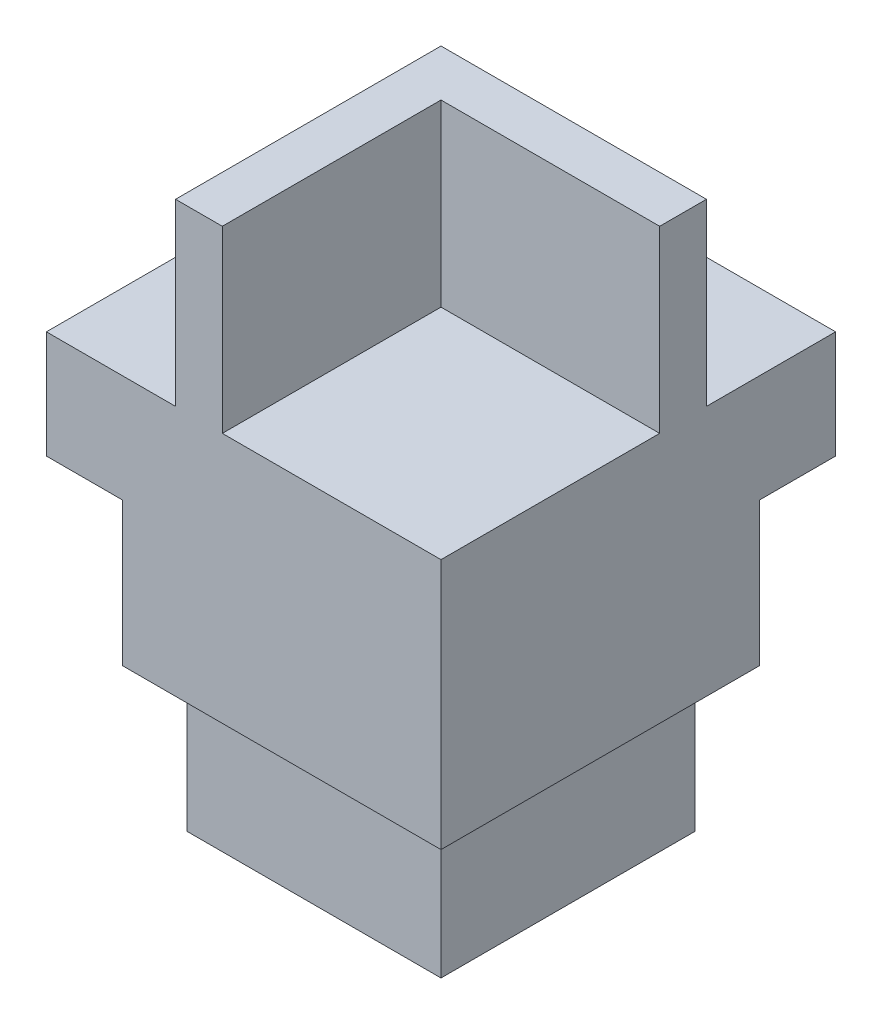
ISO-10303-21;
HEADER;
FILE_DESCRIPTION(('STEP AP214'),'2;1');
FILE_NAME('part.step','',(''),(''),'','','');
FILE_SCHEMA(('AUTOMOTIVE_DESIGN { 1 0 10303 214 1 1 1 1 }'));
ENDSEC;
DATA;
#1=APPLICATION_CONTEXT('core data for automotive mechanical design processes');
#2=APPLICATION_PROTOCOL_DEFINITION('international standard','automotive_design',2000,#1);
#3=PRODUCT_CONTEXT('',#1,'mechanical');
#4=PRODUCT('Part','Part','',(#3));
#5=PRODUCT_RELATED_PRODUCT_CATEGORY('part','',(#4));
#6=PRODUCT_DEFINITION_FORMATION('','',#4);
#7=PRODUCT_DEFINITION_CONTEXT('part definition',#1,'design');
#8=PRODUCT_DEFINITION('design','',#6,#7);
#9=PRODUCT_DEFINITION_SHAPE('','',#8);
#10=(LENGTH_UNIT() NAMED_UNIT(*) SI_UNIT(.MILLI.,.METRE.));
#11=(NAMED_UNIT(*) PLANE_ANGLE_UNIT() SI_UNIT($,.RADIAN.));
#12=(NAMED_UNIT(*) SI_UNIT($,.STERADIAN.) SOLID_ANGLE_UNIT());
#13=UNCERTAINTY_MEASURE_WITH_UNIT(LENGTH_MEASURE(1.E-05),#10,'distance_accuracy_value','');
#14=(GEOMETRIC_REPRESENTATION_CONTEXT(3) GLOBAL_UNCERTAINTY_ASSIGNED_CONTEXT((#13)) GLOBAL_UNIT_ASSIGNED_CONTEXT((#10,
#11,#12)) REPRESENTATION_CONTEXT('',''));
#15=CARTESIAN_POINT('',(0.,0.,0.));
#16=DIRECTION('',(0.,0.,1.));
#17=DIRECTION('',(1.,0.,0.));
#18=AXIS2_PLACEMENT_3D('',#15,#16,#17);
#19=CARTESIAN_POINT('',(11.9599615463912,40.,25.3407277505822));
#20=DIRECTION('',(-1.,0.,0.));
#21=DIRECTION('',(0.,0.,1.));
#22=AXIS2_PLACEMENT_3D('',#19,#20,#21);
#23=PLANE('',#22);
#24=DIRECTION('',(0.,1.,0.));
#25=VECTOR('',#24,1.);
#26=CARTESIAN_POINT('',(11.9599615463912,27.5,34.3407277505822));
#27=LINE('',#26,#25);
#28=CARTESIAN_POINT('',(11.9599615463912,27.5,34.3407277505822));
#29=VERTEX_POINT('',#28);
#30=CARTESIAN_POINT('',(11.9599615463912,40.,34.3407277505822));
#31=VERTEX_POINT('',#30);
#32=EDGE_CURVE('E186',#29,#31,#27,.T.);
#33=ORIENTED_EDGE('',*,*,#32,.T.);
#34=DIRECTION('',(0.,0.,-1.));
#35=VECTOR('',#34,1.);
#36=CARTESIAN_POINT('',(11.9599615463912,40.,25.3407277505822));
#37=LINE('',#36,#35);
#38=CARTESIAN_POINT('',(11.9599615463912,40.,37.6007277505823));
#39=VERTEX_POINT('',#38);
#40=EDGE_CURVE('E314',#39,#31,#37,.T.);
#41=ORIENTED_EDGE('',*,*,#40,.F.);
#42=DIRECTION('',(0.,1.,0.));
#43=VECTOR('',#42,1.);
#44=CARTESIAN_POINT('',(11.9599615463912,27.5,37.6007277505823));
#45=LINE('',#44,#43);
#46=CARTESIAN_POINT('',(11.9599615463912,27.5,37.6007277505823));
#47=VERTEX_POINT('',#46);
#48=EDGE_CURVE('E297',#47,#39,#45,.T.);
#49=ORIENTED_EDGE('',*,*,#48,.F.);
#50=DIRECTION('',(0.,0.,-1.));
#51=VECTOR('',#50,1.);
#52=CARTESIAN_POINT('',(11.9599615463912,27.5,52.8407277505822));
#53=LINE('',#52,#51);
#54=CARTESIAN_POINT('',(11.9599615463912,27.5,52.8407277505822));
#55=VERTEX_POINT('',#54);
#56=EDGE_CURVE('E281',#55,#47,#53,.T.);
#57=ORIENTED_EDGE('',*,*,#56,.F.);
#58=DIRECTION('',(0.,-1.,0.));
#59=VECTOR('',#58,1.);
#60=CARTESIAN_POINT('',(11.9599615463912,40.,52.8407277505822));
#61=LINE('',#60,#59);
#62=CARTESIAN_POINT('',(11.9599615463912,10.,52.8407277505822));
#63=VERTEX_POINT('',#62);
#64=EDGE_CURVE('E48',#55,#63,#61,.T.);
#65=ORIENTED_EDGE('',*,*,#64,.T.);
#66=DIRECTION('',(0.,0.,1.));
#67=VECTOR('',#66,1.);
#68=CARTESIAN_POINT('',(11.9599615463912,10.,52.8407277505822));
#69=LINE('',#68,#67);
#70=CARTESIAN_POINT('',(11.9599615463912,10.,30.6407277505822));
#71=VERTEX_POINT('',#70);
#72=EDGE_CURVE('E226',#71,#63,#69,.T.);
#73=ORIENTED_EDGE('',*,*,#72,.F.);
#74=DIRECTION('',(0.,-1.,0.));
#75=VECTOR('',#74,1.);
#76=CARTESIAN_POINT('',(11.9599615463912,20.,30.6407277505822));
#77=LINE('',#76,#75);
#78=CARTESIAN_POINT('',(11.9599615463912,20.,30.6407277505822));
#79=VERTEX_POINT('',#78);
#80=EDGE_CURVE('E274',#79,#71,#77,.T.);
#81=ORIENTED_EDGE('',*,*,#80,.F.);
#82=DIRECTION('',(0.,0.,1.));
#83=VECTOR('',#82,1.);
#84=CARTESIAN_POINT('',(11.9599615463912,20.,0.));
#85=LINE('',#84,#83);
#86=CARTESIAN_POINT('',(11.9599615463912,20.,25.3407277505822));
#87=VERTEX_POINT('',#86);
#88=EDGE_CURVE('E261',#87,#79,#85,.T.);
#89=ORIENTED_EDGE('',*,*,#88,.F.);
#90=DIRECTION('',(0.,-1.,0.));
#91=VECTOR('',#90,1.);
#92=CARTESIAN_POINT('',(11.9599615463912,40.,25.3407277505822));
#93=LINE('',#92,#91);
#94=CARTESIAN_POINT('',(11.9599615463912,27.5,25.3407277505822));
#95=VERTEX_POINT('',#94);
#96=EDGE_CURVE('E321',#95,#87,#93,.T.);
#97=ORIENTED_EDGE('',*,*,#96,.F.);
#98=DIRECTION('',(0.,0.,-1.));
#99=VECTOR('',#98,1.);
#100=CARTESIAN_POINT('',(11.9599615463912,27.5,0.));
#101=LINE('',#100,#99);
#102=EDGE_CURVE('E352',#29,#95,#101,.T.);
#103=ORIENTED_EDGE('',*,*,#102,.F.);
#104=EDGE_LOOP('',(#33,#41,#49,#57,#65,#73,#81,#89,#97,#103));
#105=FACE_BOUND('',#104,.T.);
#106=ADVANCED_FACE('F39',(#105),#23,.F.);
#107=CARTESIAN_POINT('',(-15.5400384536088,40.,25.3407277505822));
#108=DIRECTION('',(1.,0.,0.));
#109=DIRECTION('',(0.,0.,-1.));
#110=AXIS2_PLACEMENT_3D('',#107,#108,#109);
#111=PLANE('',#110);
#112=DIRECTION('',(0.,0.,1.));
#113=VECTOR('',#112,1.);
#114=CARTESIAN_POINT('',(-15.5400384536088,27.5,0.));
#115=LINE('',#114,#113);
#116=CARTESIAN_POINT('',(-15.5400384536088,27.5,25.3407277505822));
#117=VERTEX_POINT('',#116);
#118=CARTESIAN_POINT('',(-15.5400384536088,27.5,52.8407277505822));
#119=VERTEX_POINT('',#118);
#120=EDGE_CURVE('E172',#117,#119,#115,.T.);
#121=ORIENTED_EDGE('',*,*,#120,.F.);
#122=DIRECTION('',(0.,-1.,0.));
#123=VECTOR('',#122,1.);
#124=CARTESIAN_POINT('',(-15.5400384536088,40.,25.3407277505822));
#125=LINE('',#124,#123);
#126=CARTESIAN_POINT('',(-15.5400384536088,20.,25.3407277505822));
#127=VERTEX_POINT('',#126);
#128=EDGE_CURVE('E318',#117,#127,#125,.T.);
#129=ORIENTED_EDGE('',*,*,#128,.T.);
#130=DIRECTION('',(0.,0.,-1.));
#131=VECTOR('',#130,1.);
#132=CARTESIAN_POINT('',(-15.5400384536088,20.,0.));
#133=LINE('',#132,#131);
#134=CARTESIAN_POINT('',(-15.5400384536088,20.,52.8407277505822));
#135=VERTEX_POINT('',#134);
#136=EDGE_CURVE('E253',#135,#127,#133,.T.);
#137=ORIENTED_EDGE('',*,*,#136,.F.);
#138=DIRECTION('',(0.,-1.,0.));
#139=VECTOR('',#138,1.);
#140=CARTESIAN_POINT('',(-15.5400384536088,40.,52.8407277505822));
#141=LINE('',#140,#139);
#142=EDGE_CURVE('E12',#119,#135,#141,.T.);
#143=ORIENTED_EDGE('',*,*,#142,.F.);
#144=EDGE_LOOP('',(#121,#129,#137,#143));
#145=FACE_BOUND('',#144,.T.);
#146=ADVANCED_FACE('F41',(#145),#111,.F.);
#147=CARTESIAN_POINT('',(-15.5400384536088,40.,25.3407277505822));
#148=DIRECTION('',(0.,0.,1.));
#149=DIRECTION('',(1.,0.,0.));
#150=AXIS2_PLACEMENT_3D('',#147,#148,#149);
#151=PLANE('',#150);
#152=DIRECTION('',(-1.,0.,0.));
#153=VECTOR('',#152,1.);
#154=CARTESIAN_POINT('',(0.,27.5,25.3407277505822));
#155=LINE('',#154,#153);
#156=EDGE_CURVE('E188',#95,#117,#155,.T.);
#157=ORIENTED_EDGE('',*,*,#156,.F.);
#158=ORIENTED_EDGE('',*,*,#96,.T.);
#159=DIRECTION('',(1.,0.,0.));
#160=VECTOR('',#159,1.);
#161=CARTESIAN_POINT('',(0.,20.,25.3407277505822));
#162=LINE('',#161,#160);
#163=EDGE_CURVE('E257',#127,#87,#162,.T.);
#164=ORIENTED_EDGE('',*,*,#163,.F.);
#165=ORIENTED_EDGE('',*,*,#128,.F.);
#166=EDGE_LOOP('',(#157,#158,#164,#165));
#167=FACE_BOUND('',#166,.T.);
#168=ADVANCED_FACE('F355',(#167),#151,.F.);
#169=CARTESIAN_POINT('',(0.,40.,0.));
#170=DIRECTION('',(0.,1.,0.));
#171=DIRECTION('',(0.,0.,1.));
#172=AXIS2_PLACEMENT_3D('',#169,#170,#171);
#173=PLANE('',#172);
#174=ORIENTED_EDGE('',*,*,#40,.T.);
#175=DIRECTION('',(-1.,0.,0.));
#176=VECTOR('',#175,1.);
#177=CARTESIAN_POINT('',(0.,40.,34.3407277505822));
#178=LINE('',#177,#176);
#179=CARTESIAN_POINT('',(-6.5400384536088,40.,34.3407277505822));
#180=VERTEX_POINT('',#179);
#181=EDGE_CURVE('E176',#31,#180,#178,.T.);
#182=ORIENTED_EDGE('',*,*,#181,.T.);
#183=DIRECTION('',(0.,0.,-1.));
#184=VECTOR('',#183,1.);
#185=CARTESIAN_POINT('',(-6.5400384536088,40.,0.));
#186=LINE('',#185,#184);
#187=CARTESIAN_POINT('',(-6.5400384536088,40.,52.8407277505822));
#188=VERTEX_POINT('',#187);
#189=EDGE_CURVE('E363',#188,#180,#186,.T.);
#190=ORIENTED_EDGE('',*,*,#189,.F.);
#191=DIRECTION('',(1.,0.,0.));
#192=VECTOR('',#191,1.);
#193=CARTESIAN_POINT('',(-15.5400384536088,40.,52.8407277505822));
#194=LINE('',#193,#192);
#195=CARTESIAN_POINT('',(-3.28003845360881,40.,52.8407277505822));
#196=VERTEX_POINT('',#195);
#197=EDGE_CURVE('E181',#188,#196,#194,.T.);
#198=ORIENTED_EDGE('',*,*,#197,.T.);
#199=DIRECTION('',(0.,0.,1.));
#200=VECTOR('',#199,1.);
#201=CARTESIAN_POINT('',(-3.28003845360881,40.,52.8407277505822));
#202=LINE('',#201,#200);
#203=CARTESIAN_POINT('',(-3.28003845360881,40.,37.6007277505823));
#204=VERTEX_POINT('',#203);
#205=EDGE_CURVE('E286',#204,#196,#202,.T.);
#206=ORIENTED_EDGE('',*,*,#205,.F.);
#207=DIRECTION('',(-1.,0.,0.));
#208=VECTOR('',#207,1.);
#209=CARTESIAN_POINT('',(11.9599615463912,40.,37.6007277505823));
#210=LINE('',#209,#208);
#211=EDGE_CURVE('E273',#39,#204,#210,.T.);
#212=ORIENTED_EDGE('',*,*,#211,.F.);
#213=EDGE_LOOP('',(#174,#182,#190,#198,#206,#212));
#214=FACE_BOUND('',#213,.T.);
#215=ADVANCED_FACE('F373',(#214),#173,.T.);
#216=CARTESIAN_POINT('',(-15.5400384536088,40.,52.8407277505822));
#217=DIRECTION('',(0.,0.,-1.));
#218=DIRECTION('',(-1.,0.,0.));
#219=AXIS2_PLACEMENT_3D('',#216,#217,#218);
#220=PLANE('',#219);
#221=ORIENTED_EDGE('',*,*,#197,.F.);
#222=DIRECTION('',(0.,1.,0.));
#223=VECTOR('',#222,1.);
#224=CARTESIAN_POINT('',(-6.54003845360881,27.5,52.8407277505822));
#225=LINE('',#224,#223);
#226=CARTESIAN_POINT('',(-6.54003845360881,27.5,52.8407277505822));
#227=VERTEX_POINT('',#226);
#228=EDGE_CURVE('E55',#227,#188,#225,.T.);
#229=ORIENTED_EDGE('',*,*,#228,.F.);
#230=DIRECTION('',(1.,0.,0.));
#231=VECTOR('',#230,1.);
#232=CARTESIAN_POINT('',(0.,27.5,52.8407277505822));
#233=LINE('',#232,#231);
#234=EDGE_CURVE('E167',#119,#227,#233,.T.);
#235=ORIENTED_EDGE('',*,*,#234,.F.);
#236=ORIENTED_EDGE('',*,*,#142,.T.);
#237=DIRECTION('',(-1.,0.,0.));
#238=VECTOR('',#237,1.);
#239=CARTESIAN_POINT('',(0.,20.,52.8407277505822));
#240=LINE('',#239,#238);
#241=CARTESIAN_POINT('',(-10.2400384536088,20.,52.8407277505822));
#242=VERTEX_POINT('',#241);
#243=EDGE_CURVE('E249',#242,#135,#240,.T.);
#244=ORIENTED_EDGE('',*,*,#243,.F.);
#245=DIRECTION('',(0.,-1.,0.));
#246=VECTOR('',#245,1.);
#247=CARTESIAN_POINT('',(-10.2400384536088,20.,52.8407277505822));
#248=LINE('',#247,#246);
#249=CARTESIAN_POINT('',(-10.2400384536088,10.,52.8407277505822));
#250=VERTEX_POINT('',#249);
#251=EDGE_CURVE('E268',#242,#250,#248,.T.);
#252=ORIENTED_EDGE('',*,*,#251,.T.);
#253=DIRECTION('',(-1.,0.,0.));
#254=VECTOR('',#253,1.);
#255=CARTESIAN_POINT('',(-10.2400384536088,10.,52.8407277505822));
#256=LINE('',#255,#254);
#257=EDGE_CURVE('E237',#63,#250,#256,.T.);
#258=ORIENTED_EDGE('',*,*,#257,.F.);
#259=ORIENTED_EDGE('',*,*,#64,.F.);
#260=DIRECTION('',(1.,0.,0.));
#261=VECTOR('',#260,1.);
#262=CARTESIAN_POINT('',(11.9599615463912,27.5,52.8407277505822));
#263=LINE('',#262,#261);
#264=CARTESIAN_POINT('',(-3.28003845360881,27.5,52.8407277505822));
#265=VERTEX_POINT('',#264);
#266=EDGE_CURVE('E294',#265,#55,#263,.T.);
#267=ORIENTED_EDGE('',*,*,#266,.F.);
#268=DIRECTION('',(0.,1.,0.));
#269=VECTOR('',#268,1.);
#270=CARTESIAN_POINT('',(-3.28003845360881,27.5,52.8407277505822));
#271=LINE('',#270,#269);
#272=EDGE_CURVE('E304',#265,#196,#271,.T.);
#273=ORIENTED_EDGE('',*,*,#272,.T.);
#274=EDGE_LOOP('',(#221,#229,#235,#236,#244,#252,#258,#259,#267,#273));
#275=FACE_BOUND('',#274,.T.);
#276=ADVANCED_FACE('F179',(#275),#220,.F.);
#277=CARTESIAN_POINT('',(-10.2400384536088,20.,0.));
#278=DIRECTION('',(-1.,0.,0.));
#279=DIRECTION('',(0.,0.,1.));
#280=AXIS2_PLACEMENT_3D('',#277,#278,#279);
#281=PLANE('',#280);
#282=DIRECTION('',(0.,-1.,0.));
#283=VECTOR('',#282,1.);
#284=CARTESIAN_POINT('',(-10.2400384536088,20.,30.6407277505822));
#285=LINE('',#284,#283);
#286=CARTESIAN_POINT('',(-10.2400384536088,20.,30.6407277505822));
#287=VERTEX_POINT('',#286);
#288=CARTESIAN_POINT('',(-10.2400384536088,10.,30.6407277505822));
#289=VERTEX_POINT('',#288);
#290=EDGE_CURVE('E269',#287,#289,#285,.T.);
#291=ORIENTED_EDGE('',*,*,#290,.T.);
#292=DIRECTION('',(0.,0.,-1.));
#293=VECTOR('',#292,1.);
#294=CARTESIAN_POINT('',(-10.2400384536088,10.,52.8407277505822));
#295=LINE('',#294,#293);
#296=EDGE_CURVE('E240',#250,#289,#295,.T.);
#297=ORIENTED_EDGE('',*,*,#296,.F.);
#298=ORIENTED_EDGE('',*,*,#251,.F.);
#299=DIRECTION('',(0.,0.,-1.));
#300=VECTOR('',#299,1.);
#301=CARTESIAN_POINT('',(-10.2400384536088,20.,0.));
#302=LINE('',#301,#300);
#303=EDGE_CURVE('E246',#242,#287,#302,.T.);
#304=ORIENTED_EDGE('',*,*,#303,.T.);
#305=EDGE_LOOP('',(#291,#297,#298,#304));
#306=FACE_BOUND('',#305,.T.);
#307=ADVANCED_FACE('F340',(#306),#281,.T.);
#308=CARTESIAN_POINT('',(0.,20.,30.6407277505822));
#309=DIRECTION('',(0.,0.,1.));
#310=DIRECTION('',(1.,0.,0.));
#311=AXIS2_PLACEMENT_3D('',#308,#309,#310);
#312=PLANE('',#311);
#313=DIRECTION('',(1.,0.,0.));
#314=VECTOR('',#313,1.);
#315=CARTESIAN_POINT('',(-10.2400384536088,10.,30.6407277505822));
#316=LINE('',#315,#314);
#317=EDGE_CURVE('E243',#289,#71,#316,.T.);
#318=ORIENTED_EDGE('',*,*,#317,.F.);
#319=ORIENTED_EDGE('',*,*,#290,.F.);
#320=DIRECTION('',(-1.,0.,0.));
#321=VECTOR('',#320,1.);
#322=CARTESIAN_POINT('',(0.,20.,30.6407277505822));
#323=LINE('',#322,#321);
#324=EDGE_CURVE('E264',#79,#287,#323,.T.);
#325=ORIENTED_EDGE('',*,*,#324,.F.);
#326=ORIENTED_EDGE('',*,*,#80,.T.);
#327=EDGE_LOOP('',(#318,#319,#325,#326));
#328=FACE_BOUND('',#327,.T.);
#329=ADVANCED_FACE('F345',(#328),#312,.F.);
#330=CARTESIAN_POINT('',(-3.28003845360881,27.5,52.8407277505822));
#331=DIRECTION('',(-1.,0.,0.));
#332=DIRECTION('',(0.,0.,1.));
#333=AXIS2_PLACEMENT_3D('',#330,#331,#332);
#334=PLANE('',#333);
#335=ORIENTED_EDGE('',*,*,#205,.T.);
#336=ORIENTED_EDGE('',*,*,#272,.F.);
#337=DIRECTION('',(0.,0.,1.));
#338=VECTOR('',#337,1.);
#339=CARTESIAN_POINT('',(-3.28003845360881,27.5,52.8407277505822));
#340=LINE('',#339,#338);
#341=CARTESIAN_POINT('',(-3.28003845360881,27.5,37.6007277505823));
#342=VERTEX_POINT('',#341);
#343=EDGE_CURVE('E290',#342,#265,#340,.T.);
#344=ORIENTED_EDGE('',*,*,#343,.F.);
#345=DIRECTION('',(0.,1.,0.));
#346=VECTOR('',#345,1.);
#347=CARTESIAN_POINT('',(-3.28003845360881,27.5,37.6007277505823));
#348=LINE('',#347,#346);
#349=EDGE_CURVE('E307',#342,#204,#348,.T.);
#350=ORIENTED_EDGE('',*,*,#349,.T.);
#351=EDGE_LOOP('',(#335,#336,#344,#350));
#352=FACE_BOUND('',#351,.T.);
#353=ADVANCED_FACE('F381',(#352),#334,.F.);
#354=CARTESIAN_POINT('',(11.9599615463912,27.5,37.6007277505823));
#355=DIRECTION('',(0.,0.,-1.));
#356=DIRECTION('',(-1.,0.,0.));
#357=AXIS2_PLACEMENT_3D('',#354,#355,#356);
#358=PLANE('',#357);
#359=ORIENTED_EDGE('',*,*,#211,.T.);
#360=ORIENTED_EDGE('',*,*,#349,.F.);
#361=DIRECTION('',(-1.,0.,0.));
#362=VECTOR('',#361,1.);
#363=CARTESIAN_POINT('',(11.9599615463912,27.5,37.6007277505823));
#364=LINE('',#363,#362);
#365=EDGE_CURVE('E285',#47,#342,#364,.T.);
#366=ORIENTED_EDGE('',*,*,#365,.F.);
#367=ORIENTED_EDGE('',*,*,#48,.T.);
#368=EDGE_LOOP('',(#359,#360,#366,#367));
#369=FACE_BOUND('',#368,.T.);
#370=ADVANCED_FACE('F376',(#369),#358,.F.);
#371=CARTESIAN_POINT('',(0.,27.5,0.));
#372=DIRECTION('',(0.,1.,0.));
#373=DIRECTION('',(0.,0.,1.));
#374=AXIS2_PLACEMENT_3D('',#371,#372,#373);
#375=PLANE('',#374);
#376=ORIENTED_EDGE('',*,*,#56,.T.);
#377=ORIENTED_EDGE('',*,*,#365,.T.);
#378=ORIENTED_EDGE('',*,*,#343,.T.);
#379=ORIENTED_EDGE('',*,*,#266,.T.);
#380=EDGE_LOOP('',(#376,#377,#378,#379));
#381=FACE_BOUND('',#380,.T.);
#382=ADVANCED_FACE('F379',(#381),#375,.T.);
#383=CARTESIAN_POINT('',(0.,20.,0.));
#384=DIRECTION('',(0.,-1.,0.));
#385=DIRECTION('',(0.,0.,-1.));
#386=AXIS2_PLACEMENT_3D('',#383,#384,#385);
#387=PLANE('',#386);
#388=ORIENTED_EDGE('',*,*,#303,.F.);
#389=ORIENTED_EDGE('',*,*,#243,.T.);
#390=ORIENTED_EDGE('',*,*,#136,.T.);
#391=ORIENTED_EDGE('',*,*,#163,.T.);
#392=ORIENTED_EDGE('',*,*,#88,.T.);
#393=ORIENTED_EDGE('',*,*,#324,.T.);
#394=EDGE_LOOP('',(#388,#389,#390,#391,#392,#393));
#395=FACE_BOUND('',#394,.T.);
#396=ADVANCED_FACE('F347',(#395),#387,.T.);
#397=CARTESIAN_POINT('',(0.,10.,0.));
#398=DIRECTION('',(0.,-1.,0.));
#399=DIRECTION('',(0.,0.,-1.));
#400=AXIS2_PLACEMENT_3D('',#397,#398,#399);
#401=PLANE('',#400);
#402=DIRECTION('',(1.,0.,0.));
#403=VECTOR('',#402,1.);
#404=CARTESIAN_POINT('',(-7.9900384536088,10.,32.8907277505822));
#405=LINE('',#404,#403);
#406=CARTESIAN_POINT('',(-7.9900384536088,10.,32.8907277505822));
#407=VERTEX_POINT('',#406);
#408=CARTESIAN_POINT('',(9.7099615463912,10.,32.8907277505822));
#409=VERTEX_POINT('',#408);
#410=EDGE_CURVE('E205',#407,#409,#405,.T.);
#411=ORIENTED_EDGE('',*,*,#410,.F.);
#412=DIRECTION('',(0.,0.,-1.));
#413=VECTOR('',#412,1.);
#414=CARTESIAN_POINT('',(-7.9900384536088,10.,50.5907277505822));
#415=LINE('',#414,#413);
#416=CARTESIAN_POINT('',(-7.9900384536088,10.,50.5907277505822));
#417=VERTEX_POINT('',#416);
#418=EDGE_CURVE('E201',#417,#407,#415,.T.);
#419=ORIENTED_EDGE('',*,*,#418,.F.);
#420=DIRECTION('',(-1.,0.,0.));
#421=VECTOR('',#420,1.);
#422=CARTESIAN_POINT('',(-7.9900384536088,10.,50.5907277505822));
#423=LINE('',#422,#421);
#424=CARTESIAN_POINT('',(9.7099615463912,10.,50.5907277505822));
#425=VERTEX_POINT('',#424);
#426=EDGE_CURVE('E196',#425,#417,#423,.T.);
#427=ORIENTED_EDGE('',*,*,#426,.F.);
#428=DIRECTION('',(0.,0.,1.));
#429=VECTOR('',#428,1.);
#430=CARTESIAN_POINT('',(9.7099615463912,10.,50.5907277505822));
#431=LINE('',#430,#429);
#432=EDGE_CURVE('E192',#409,#425,#431,.T.);
#433=ORIENTED_EDGE('',*,*,#432,.F.);
#434=EDGE_LOOP('',(#411,#419,#427,#433));
#435=FACE_BOUND('',#434,.T.);
#436=ORIENTED_EDGE('',*,*,#72,.T.);
#437=ORIENTED_EDGE('',*,*,#257,.T.);
#438=ORIENTED_EDGE('',*,*,#296,.T.);
#439=ORIENTED_EDGE('',*,*,#317,.T.);
#440=EDGE_LOOP('',(#436,#437,#438,#439));
#441=FACE_BOUND('',#440,.T.);
#442=ADVANCED_FACE('F337',(#435,#441),#401,.T.);
#443=CARTESIAN_POINT('',(9.7099615463912,10.,50.5907277505822));
#444=DIRECTION('',(1.,0.,0.));
#445=DIRECTION('',(0.,0.,-1.));
#446=AXIS2_PLACEMENT_3D('',#443,#444,#445);
#447=PLANE('',#446);
#448=DIRECTION('',(0.,0.,1.));
#449=VECTOR('',#448,1.);
#450=CARTESIAN_POINT('',(9.7099615463912,0.,50.5907277505822));
#451=LINE('',#450,#449);
#452=CARTESIAN_POINT('',(9.7099615463912,0.,32.8907277505822));
#453=VERTEX_POINT('',#452);
#454=CARTESIAN_POINT('',(9.7099615463912,0.,50.5907277505822));
#455=VERTEX_POINT('',#454);
#456=EDGE_CURVE('E210',#453,#455,#451,.T.);
#457=ORIENTED_EDGE('',*,*,#456,.F.);
#458=DIRECTION('',(0.,-1.,0.));
#459=VECTOR('',#458,1.);
#460=CARTESIAN_POINT('',(9.7099615463912,10.,32.8907277505822));
#461=LINE('',#460,#459);
#462=EDGE_CURVE('E223',#409,#453,#461,.T.);
#463=ORIENTED_EDGE('',*,*,#462,.F.);
#464=ORIENTED_EDGE('',*,*,#432,.T.);
#465=DIRECTION('',(0.,-1.,0.));
#466=VECTOR('',#465,1.);
#467=CARTESIAN_POINT('',(9.7099615463912,10.,50.5907277505822));
#468=LINE('',#467,#466);
#469=EDGE_CURVE('E209',#425,#455,#468,.T.);
#470=ORIENTED_EDGE('',*,*,#469,.T.);
#471=EDGE_LOOP('',(#457,#463,#464,#470));
#472=FACE_BOUND('',#471,.T.);
#473=ADVANCED_FACE('F426',(#472),#447,.T.);
#474=CARTESIAN_POINT('',(-7.9900384536088,10.,32.8907277505822));
#475=DIRECTION('',(0.,0.,-1.));
#476=DIRECTION('',(-1.,0.,0.));
#477=AXIS2_PLACEMENT_3D('',#474,#475,#476);
#478=PLANE('',#477);
#479=DIRECTION('',(1.,0.,0.));
#480=VECTOR('',#479,1.);
#481=CARTESIAN_POINT('',(-7.9900384536088,0.,32.8907277505822));
#482=LINE('',#481,#480);
#483=CARTESIAN_POINT('',(-7.9900384536088,0.,32.8907277505822));
#484=VERTEX_POINT('',#483);
#485=EDGE_CURVE('E197',#484,#453,#482,.T.);
#486=ORIENTED_EDGE('',*,*,#485,.F.);
#487=DIRECTION('',(0.,-1.,0.));
#488=VECTOR('',#487,1.);
#489=CARTESIAN_POINT('',(-7.9900384536088,10.,32.8907277505822));
#490=LINE('',#489,#488);
#491=EDGE_CURVE('E227',#407,#484,#490,.T.);
#492=ORIENTED_EDGE('',*,*,#491,.F.);
#493=ORIENTED_EDGE('',*,*,#410,.T.);
#494=ORIENTED_EDGE('',*,*,#462,.T.);
#495=EDGE_LOOP('',(#486,#492,#493,#494));
#496=FACE_BOUND('',#495,.T.);
#497=ADVANCED_FACE('F432',(#496),#478,.T.);
#498=CARTESIAN_POINT('',(-7.9900384536088,10.,50.5907277505822));
#499=DIRECTION('',(-1.,0.,0.));
#500=DIRECTION('',(0.,0.,1.));
#501=AXIS2_PLACEMENT_3D('',#498,#499,#500);
#502=PLANE('',#501);
#503=DIRECTION('',(0.,0.,-1.));
#504=VECTOR('',#503,1.);
#505=CARTESIAN_POINT('',(-7.9900384536088,0.,50.5907277505822));
#506=LINE('',#505,#504);
#507=CARTESIAN_POINT('',(-7.9900384536088,0.,50.5907277505822));
#508=VERTEX_POINT('',#507);
#509=EDGE_CURVE('E63',#508,#484,#506,.T.);
#510=ORIENTED_EDGE('',*,*,#509,.F.);
#511=DIRECTION('',(0.,-1.,0.));
#512=VECTOR('',#511,1.);
#513=CARTESIAN_POINT('',(-7.9900384536088,10.,50.5907277505822));
#514=LINE('',#513,#512);
#515=EDGE_CURVE('E230',#417,#508,#514,.T.);
#516=ORIENTED_EDGE('',*,*,#515,.F.);
#517=ORIENTED_EDGE('',*,*,#418,.T.);
#518=ORIENTED_EDGE('',*,*,#491,.T.);
#519=EDGE_LOOP('',(#510,#516,#517,#518));
#520=FACE_BOUND('',#519,.T.);
#521=ADVANCED_FACE('F419',(#520),#502,.T.);
#522=CARTESIAN_POINT('',(-7.9900384536088,10.,50.5907277505822));
#523=DIRECTION('',(0.,0.,1.));
#524=DIRECTION('',(1.,0.,0.));
#525=AXIS2_PLACEMENT_3D('',#522,#523,#524);
#526=PLANE('',#525);
#527=DIRECTION('',(-1.,0.,0.));
#528=VECTOR('',#527,1.);
#529=CARTESIAN_POINT('',(-7.9900384536088,0.,50.5907277505822));
#530=LINE('',#529,#528);
#531=EDGE_CURVE('E214',#455,#508,#530,.T.);
#532=ORIENTED_EDGE('',*,*,#531,.F.);
#533=ORIENTED_EDGE('',*,*,#469,.F.);
#534=ORIENTED_EDGE('',*,*,#426,.T.);
#535=ORIENTED_EDGE('',*,*,#515,.T.);
#536=EDGE_LOOP('',(#532,#533,#534,#535));
#537=FACE_BOUND('',#536,.T.);
#538=ADVANCED_FACE('F412',(#537),#526,.T.);
#539=CARTESIAN_POINT('',(0.,0.,0.));
#540=DIRECTION('',(0.,1.,0.));
#541=DIRECTION('',(0.,0.,1.));
#542=AXIS2_PLACEMENT_3D('',#539,#540,#541);
#543=PLANE('',#542);
#544=ORIENTED_EDGE('',*,*,#456,.T.);
#545=ORIENTED_EDGE('',*,*,#531,.T.);
#546=ORIENTED_EDGE('',*,*,#509,.T.);
#547=ORIENTED_EDGE('',*,*,#485,.T.);
#548=EDGE_LOOP('',(#544,#545,#546,#547));
#549=FACE_BOUND('',#548,.T.);
#550=ADVANCED_FACE('F409',(#549),#543,.F.);
#551=CARTESIAN_POINT('',(0.,27.5,34.3407277505822));
#552=DIRECTION('',(0.,0.,-1.));
#553=DIRECTION('',(-1.,0.,0.));
#554=AXIS2_PLACEMENT_3D('',#551,#552,#553);
#555=PLANE('',#554);
#556=ORIENTED_EDGE('',*,*,#181,.F.);
#557=ORIENTED_EDGE('',*,*,#32,.F.);
#558=DIRECTION('',(-1.,0.,0.));
#559=VECTOR('',#558,1.);
#560=CARTESIAN_POINT('',(0.,27.5,34.3407277505822));
#561=LINE('',#560,#559);
#562=CARTESIAN_POINT('',(-6.5400384536088,27.5,34.3407277505822));
#563=VERTEX_POINT('',#562);
#564=EDGE_CURVE('E166',#29,#563,#561,.T.);
#565=ORIENTED_EDGE('',*,*,#564,.T.);
#566=DIRECTION('',(0.,1.,0.));
#567=VECTOR('',#566,1.);
#568=CARTESIAN_POINT('',(-6.5400384536088,27.5,34.3407277505822));
#569=LINE('',#568,#567);
#570=EDGE_CURVE('E162',#563,#180,#569,.T.);
#571=ORIENTED_EDGE('',*,*,#570,.T.);
#572=EDGE_LOOP('',(#556,#557,#565,#571));
#573=FACE_BOUND('',#572,.T.);
#574=ADVANCED_FACE('F411',(#573),#555,.T.);
#575=CARTESIAN_POINT('',(-6.5400384536088,27.5,0.));
#576=DIRECTION('',(1.,0.,0.));
#577=DIRECTION('',(0.,0.,-1.));
#578=AXIS2_PLACEMENT_3D('',#575,#576,#577);
#579=PLANE('',#578);
#580=ORIENTED_EDGE('',*,*,#189,.T.);
#581=ORIENTED_EDGE('',*,*,#570,.F.);
#582=DIRECTION('',(0.,0.,-1.));
#583=VECTOR('',#582,1.);
#584=CARTESIAN_POINT('',(-6.5400384536088,27.5,0.));
#585=LINE('',#584,#583);
#586=EDGE_CURVE('E159',#227,#563,#585,.T.);
#587=ORIENTED_EDGE('',*,*,#586,.F.);
#588=ORIENTED_EDGE('',*,*,#228,.T.);
#589=EDGE_LOOP('',(#580,#581,#587,#588));
#590=FACE_BOUND('',#589,.T.);
#591=ADVANCED_FACE('F161',(#590),#579,.F.);
#592=CARTESIAN_POINT('',(0.,27.5,0.));
#593=DIRECTION('',(0.,1.,0.));
#594=DIRECTION('',(0.,0.,1.));
#595=AXIS2_PLACEMENT_3D('',#592,#593,#594);
#596=PLANE('',#595);
#597=ORIENTED_EDGE('',*,*,#234,.T.);
#598=ORIENTED_EDGE('',*,*,#586,.T.);
#599=ORIENTED_EDGE('',*,*,#564,.F.);
#600=ORIENTED_EDGE('',*,*,#102,.T.);
#601=ORIENTED_EDGE('',*,*,#156,.T.);
#602=ORIENTED_EDGE('',*,*,#120,.T.);
#603=EDGE_LOOP('',(#597,#598,#599,#600,#601,#602));
#604=FACE_BOUND('',#603,.T.);
#605=ADVANCED_FACE('F170',(#604),#596,.T.);
#606=CLOSED_SHELL('',(#106,#146,#168,#215,#276,#307,#329,#353,#370,#382,#396,#442,#473,#497,
#521,#538,#550,#574,#591,#605));
#607=MANIFOLD_SOLID_BREP('B2',#606);
#608=ADVANCED_BREP_SHAPE_REPRESENTATION('',(#18,#607),#14);
#609=SHAPE_DEFINITION_REPRESENTATION(#9,#608);
ENDSEC;
END-ISO-10303-21;
